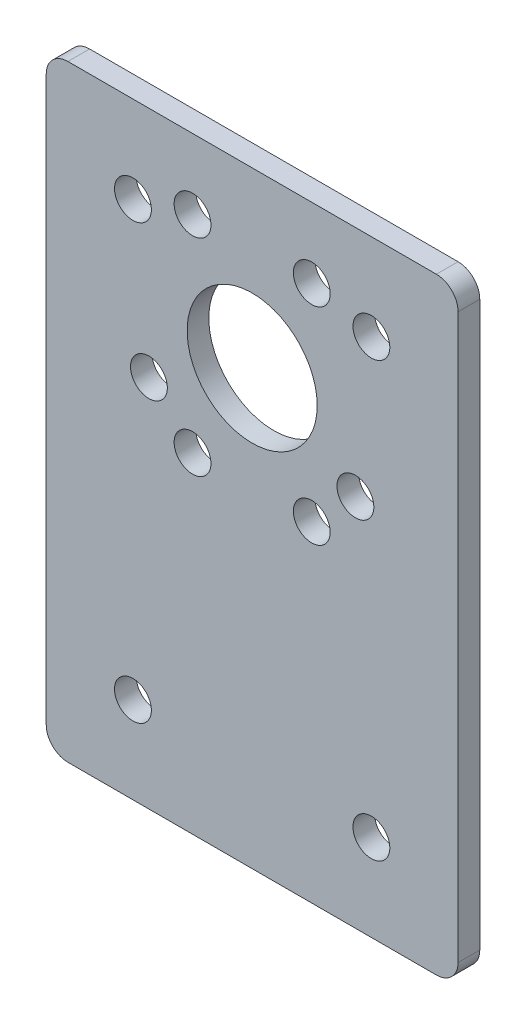
ISO-10303-21;
HEADER;
FILE_DESCRIPTION(('STEP AP214'),'2;1');
FILE_NAME('part.step','',(''),(''),'','','');
FILE_SCHEMA(('AUTOMOTIVE_DESIGN { 1 0 10303 214 1 1 1 1 }'));
ENDSEC;
DATA;
#1=APPLICATION_CONTEXT('core data for automotive mechanical design processes');
#2=APPLICATION_PROTOCOL_DEFINITION('international standard','automotive_design',2000,#1);
#3=PRODUCT_CONTEXT('',#1,'mechanical');
#4=PRODUCT('Part','Part','',(#3));
#5=PRODUCT_RELATED_PRODUCT_CATEGORY('part','',(#4));
#6=PRODUCT_DEFINITION_FORMATION('','',#4);
#7=PRODUCT_DEFINITION_CONTEXT('part definition',#1,'design');
#8=PRODUCT_DEFINITION('design','',#6,#7);
#9=PRODUCT_DEFINITION_SHAPE('','',#8);
#10=(LENGTH_UNIT() NAMED_UNIT(*) SI_UNIT(.MILLI.,.METRE.));
#11=(NAMED_UNIT(*) PLANE_ANGLE_UNIT() SI_UNIT($,.RADIAN.));
#12=(NAMED_UNIT(*) SI_UNIT($,.STERADIAN.) SOLID_ANGLE_UNIT());
#13=UNCERTAINTY_MEASURE_WITH_UNIT(LENGTH_MEASURE(1.E-05),#10,'distance_accuracy_value','');
#14=(GEOMETRIC_REPRESENTATION_CONTEXT(3) GLOBAL_UNCERTAINTY_ASSIGNED_CONTEXT((#13)) GLOBAL_UNIT_ASSIGNED_CONTEXT((#10,
#11,#12)) REPRESENTATION_CONTEXT('',''));
#15=CARTESIAN_POINT('',(0.,0.,0.));
#16=DIRECTION('',(0.,0.,1.));
#17=DIRECTION('',(1.,0.,0.));
#18=AXIS2_PLACEMENT_3D('',#15,#16,#17);
#19=CARTESIAN_POINT('',(-17.,26.,2.));
#20=DIRECTION('',(0.,0.,-1.));
#21=DIRECTION('',(-1.,0.,0.));
#22=AXIS2_PLACEMENT_3D('',#19,#20,#21);
#23=PLANE('',#22);
#24=CARTESIAN_POINT('',(-5.5,2.47372055837112,2.));
#25=DIRECTION('',(0.,0.,-1.));
#26=DIRECTION('',(-1.,0.,0.));
#27=AXIS2_PLACEMENT_3D('',#24,#25,#26);
#28=CIRCLE('',#27,1.7);
#29=CARTESIAN_POINT('',(-7.2,2.47372055837112,2.));
#30=VERTEX_POINT('',#29);
#31=EDGE_CURVE('E295',#30,#30,#28,.T.);
#32=ORIENTED_EDGE('',*,*,#31,.T.);
#33=EDGE_LOOP('',(#32));
#34=FACE_BOUND('',#33,.T.);
#35=CARTESIAN_POINT('',(-5.5,21.5262794416289,2.));
#36=DIRECTION('',(0.,0.,-1.));
#37=DIRECTION('',(-1.,0.,0.));
#38=AXIS2_PLACEMENT_3D('',#35,#36,#37);
#39=CIRCLE('',#38,1.7);
#40=CARTESIAN_POINT('',(-7.2,21.5262794416289,2.));
#41=VERTEX_POINT('',#40);
#42=EDGE_CURVE('E287',#41,#41,#39,.T.);
#43=ORIENTED_EDGE('',*,*,#42,.T.);
#44=EDGE_LOOP('',(#43));
#45=FACE_BOUND('',#44,.T.);
#46=CARTESIAN_POINT('',(5.5,21.5262794416289,2.));
#47=DIRECTION('',(0.,0.,-1.));
#48=DIRECTION('',(-1.,0.,0.));
#49=AXIS2_PLACEMENT_3D('',#46,#47,#48);
#50=CIRCLE('',#49,1.7);
#51=CARTESIAN_POINT('',(3.8,21.5262794416289,2.));
#52=VERTEX_POINT('',#51);
#53=EDGE_CURVE('E279',#52,#52,#50,.T.);
#54=ORIENTED_EDGE('',*,*,#53,.T.);
#55=EDGE_LOOP('',(#54));
#56=FACE_BOUND('',#55,.T.);
#57=CARTESIAN_POINT('',(5.5,2.47372055837112,2.));
#58=DIRECTION('',(0.,0.,-1.));
#59=DIRECTION('',(-1.,0.,0.));
#60=AXIS2_PLACEMENT_3D('',#57,#58,#59);
#61=CIRCLE('',#60,1.7);
#62=CARTESIAN_POINT('',(3.8,2.47372055837112,2.));
#63=VERTEX_POINT('',#62);
#64=EDGE_CURVE('E271',#63,#63,#61,.T.);
#65=ORIENTED_EDGE('',*,*,#64,.T.);
#66=EDGE_LOOP('',(#65));
#67=FACE_BOUND('',#66,.T.);
#68=CARTESIAN_POINT('',(9.52627944162889,6.50000000000001,2.));
#69=DIRECTION('',(0.,0.,-1.));
#70=DIRECTION('',(-1.,0.,0.));
#71=AXIS2_PLACEMENT_3D('',#68,#69,#70);
#72=CIRCLE('',#71,1.7);
#73=CARTESIAN_POINT('',(7.82627944162889,6.50000000000001,2.));
#74=VERTEX_POINT('',#73);
#75=EDGE_CURVE('E263',#74,#74,#72,.T.);
#76=ORIENTED_EDGE('',*,*,#75,.T.);
#77=EDGE_LOOP('',(#76));
#78=FACE_BOUND('',#77,.T.);
#79=CARTESIAN_POINT('',(-9.52627944162889,6.50000000000001,2.));
#80=DIRECTION('',(0.,0.,-1.));
#81=DIRECTION('',(-1.,0.,0.));
#82=AXIS2_PLACEMENT_3D('',#79,#80,#81);
#83=CIRCLE('',#82,1.7);
#84=CARTESIAN_POINT('',(-11.2262794416289,6.50000000000001,2.));
#85=VERTEX_POINT('',#84);
#86=EDGE_CURVE('E255',#85,#85,#83,.T.);
#87=ORIENTED_EDGE('',*,*,#86,.T.);
#88=EDGE_LOOP('',(#87));
#89=FACE_BOUND('',#88,.T.);
#90=CARTESIAN_POINT('',(11.,20.,2.));
#91=DIRECTION('',(0.,0.,-1.));
#92=DIRECTION('',(-1.,0.,0.));
#93=AXIS2_PLACEMENT_3D('',#90,#91,#92);
#94=CIRCLE('',#93,1.7);
#95=CARTESIAN_POINT('',(9.3,20.,2.));
#96=VERTEX_POINT('',#95);
#97=EDGE_CURVE('E247',#96,#96,#94,.T.);
#98=ORIENTED_EDGE('',*,*,#97,.T.);
#99=EDGE_LOOP('',(#98));
#100=FACE_BOUND('',#99,.T.);
#101=CARTESIAN_POINT('',(-11.,20.,2.));
#102=DIRECTION('',(0.,0.,-1.));
#103=DIRECTION('',(-1.,0.,0.));
#104=AXIS2_PLACEMENT_3D('',#101,#102,#103);
#105=CIRCLE('',#104,1.7);
#106=CARTESIAN_POINT('',(-12.7,20.,2.));
#107=VERTEX_POINT('',#106);
#108=EDGE_CURVE('E239',#107,#107,#105,.T.);
#109=ORIENTED_EDGE('',*,*,#108,.T.);
#110=EDGE_LOOP('',(#109));
#111=FACE_BOUND('',#110,.T.);
#112=CARTESIAN_POINT('',(11.,-20.,2.));
#113=DIRECTION('',(0.,0.,-1.));
#114=DIRECTION('',(-1.,0.,0.));
#115=AXIS2_PLACEMENT_3D('',#112,#113,#114);
#116=CIRCLE('',#115,1.7);
#117=CARTESIAN_POINT('',(9.3,-20.,2.));
#118=VERTEX_POINT('',#117);
#119=EDGE_CURVE('E231',#118,#118,#116,.T.);
#120=ORIENTED_EDGE('',*,*,#119,.T.);
#121=EDGE_LOOP('',(#120));
#122=FACE_BOUND('',#121,.T.);
#123=CARTESIAN_POINT('',(-11.,-20.,2.));
#124=DIRECTION('',(0.,0.,-1.));
#125=DIRECTION('',(-1.,0.,0.));
#126=AXIS2_PLACEMENT_3D('',#123,#124,#125);
#127=CIRCLE('',#126,1.7);
#128=CARTESIAN_POINT('',(-12.7,-20.,2.));
#129=VERTEX_POINT('',#128);
#130=EDGE_CURVE('E220',#129,#129,#127,.T.);
#131=ORIENTED_EDGE('',*,*,#130,.T.);
#132=EDGE_LOOP('',(#131));
#133=FACE_BOUND('',#132,.T.);
#134=CARTESIAN_POINT('',(-17.,26.,2.));
#135=DIRECTION('',(0.,0.,1.));
#136=DIRECTION('',(-1.,0.,0.));
#137=AXIS2_PLACEMENT_3D('',#134,#135,#136);
#138=CIRCLE('',#137,2.);
#139=CARTESIAN_POINT('',(-17.,28.,2.));
#140=VERTEX_POINT('',#139);
#141=CARTESIAN_POINT('',(-19.,26.,2.));
#142=VERTEX_POINT('',#141);
#143=EDGE_CURVE('E169',#140,#142,#138,.T.);
#144=ORIENTED_EDGE('',*,*,#143,.T.);
#145=DIRECTION('',(0.,-1.,0.));
#146=VECTOR('',#145,1.);
#147=CARTESIAN_POINT('',(-19.,26.,2.));
#148=LINE('',#147,#146);
#149=CARTESIAN_POINT('',(-19.,-26.,2.));
#150=VERTEX_POINT('',#149);
#151=EDGE_CURVE('E104',#142,#150,#148,.T.);
#152=ORIENTED_EDGE('',*,*,#151,.T.);
#153=CARTESIAN_POINT('',(-17.,-26.,2.));
#154=DIRECTION('',(0.,0.,1.));
#155=DIRECTION('',(-1.,0.,0.));
#156=AXIS2_PLACEMENT_3D('',#153,#154,#155);
#157=CIRCLE('',#156,2.);
#158=CARTESIAN_POINT('',(-17.,-28.,2.));
#159=VERTEX_POINT('',#158);
#160=EDGE_CURVE('E191',#150,#159,#157,.T.);
#161=ORIENTED_EDGE('',*,*,#160,.T.);
#162=DIRECTION('',(1.,0.,0.));
#163=VECTOR('',#162,1.);
#164=CARTESIAN_POINT('',(-17.,-28.,2.));
#165=LINE('',#164,#163);
#166=CARTESIAN_POINT('',(17.,-28.,2.));
#167=VERTEX_POINT('',#166);
#168=EDGE_CURVE('E205',#159,#167,#165,.T.);
#169=ORIENTED_EDGE('',*,*,#168,.T.);
#170=CARTESIAN_POINT('',(17.,-26.,2.));
#171=DIRECTION('',(0.,0.,1.));
#172=DIRECTION('',(1.,0.,0.));
#173=AXIS2_PLACEMENT_3D('',#170,#171,#172);
#174=CIRCLE('',#173,2.);
#175=CARTESIAN_POINT('',(19.,-26.,2.));
#176=VERTEX_POINT('',#175);
#177=EDGE_CURVE('E123',#167,#176,#174,.T.);
#178=ORIENTED_EDGE('',*,*,#177,.T.);
#179=DIRECTION('',(0.,1.,0.));
#180=VECTOR('',#179,1.);
#181=CARTESIAN_POINT('',(19.,26.,2.));
#182=LINE('',#181,#180);
#183=CARTESIAN_POINT('',(19.,26.,2.));
#184=VERTEX_POINT('',#183);
#185=EDGE_CURVE('E117',#176,#184,#182,.T.);
#186=ORIENTED_EDGE('',*,*,#185,.T.);
#187=CARTESIAN_POINT('',(17.,26.,2.));
#188=DIRECTION('',(0.,0.,1.));
#189=DIRECTION('',(1.,0.,0.));
#190=AXIS2_PLACEMENT_3D('',#187,#188,#189);
#191=CIRCLE('',#190,2.);
#192=CARTESIAN_POINT('',(17.,28.,2.));
#193=VERTEX_POINT('',#192);
#194=EDGE_CURVE('E121',#184,#193,#191,.T.);
#195=ORIENTED_EDGE('',*,*,#194,.T.);
#196=DIRECTION('',(-1.,0.,0.));
#197=VECTOR('',#196,1.);
#198=CARTESIAN_POINT('',(-17.,28.,2.));
#199=LINE('',#198,#197);
#200=EDGE_CURVE('E61',#193,#140,#199,.T.);
#201=ORIENTED_EDGE('',*,*,#200,.T.);
#202=EDGE_LOOP('',(#144,#152,#161,#169,#178,#186,#195,#201));
#203=FACE_BOUND('',#202,.T.);
#204=CARTESIAN_POINT('',(0.,12.,2.));
#205=DIRECTION('',(0.,0.,1.));
#206=DIRECTION('',(1.,0.,0.));
#207=AXIS2_PLACEMENT_3D('',#204,#205,#206);
#208=CIRCLE('',#207,6.);
#209=CARTESIAN_POINT('',(6.,12.,2.));
#210=VERTEX_POINT('',#209);
#211=EDGE_CURVE('E151',#210,#210,#208,.T.);
#212=ORIENTED_EDGE('',*,*,#211,.F.);
#213=EDGE_LOOP('',(#212));
#214=FACE_BOUND('',#213,.T.);
#215=ADVANCED_FACE('F43',(#34,#45,#56,#67,#78,#89,#100,#111,#122,#133,#203,#214),#23,.F.);
#216=CARTESIAN_POINT('',(-17.,26.,0.));
#217=DIRECTION('',(0.,0.,-1.));
#218=DIRECTION('',(-1.,0.,0.));
#219=AXIS2_PLACEMENT_3D('',#216,#217,#218);
#220=PLANE('',#219);
#221=CARTESIAN_POINT('',(-5.5,2.47372055837112,0.));
#222=DIRECTION('',(0.,0.,-1.));
#223=DIRECTION('',(-1.,0.,0.));
#224=AXIS2_PLACEMENT_3D('',#221,#222,#223);
#225=CIRCLE('',#224,1.7);
#226=CARTESIAN_POINT('',(-7.2,2.47372055837112,0.));
#227=VERTEX_POINT('',#226);
#228=EDGE_CURVE('E299',#227,#227,#225,.T.);
#229=ORIENTED_EDGE('',*,*,#228,.F.);
#230=EDGE_LOOP('',(#229));
#231=FACE_BOUND('',#230,.T.);
#232=CARTESIAN_POINT('',(-5.5,21.5262794416289,0.));
#233=DIRECTION('',(0.,0.,-1.));
#234=DIRECTION('',(-1.,0.,0.));
#235=AXIS2_PLACEMENT_3D('',#232,#233,#234);
#236=CIRCLE('',#235,1.7);
#237=CARTESIAN_POINT('',(-7.2,21.5262794416289,0.));
#238=VERTEX_POINT('',#237);
#239=EDGE_CURVE('E291',#238,#238,#236,.T.);
#240=ORIENTED_EDGE('',*,*,#239,.F.);
#241=EDGE_LOOP('',(#240));
#242=FACE_BOUND('',#241,.T.);
#243=CARTESIAN_POINT('',(5.5,21.5262794416289,0.));
#244=DIRECTION('',(0.,0.,-1.));
#245=DIRECTION('',(-1.,0.,0.));
#246=AXIS2_PLACEMENT_3D('',#243,#244,#245);
#247=CIRCLE('',#246,1.7);
#248=CARTESIAN_POINT('',(3.8,21.5262794416289,0.));
#249=VERTEX_POINT('',#248);
#250=EDGE_CURVE('E283',#249,#249,#247,.T.);
#251=ORIENTED_EDGE('',*,*,#250,.F.);
#252=EDGE_LOOP('',(#251));
#253=FACE_BOUND('',#252,.T.);
#254=CARTESIAN_POINT('',(5.5,2.47372055837112,0.));
#255=DIRECTION('',(0.,0.,-1.));
#256=DIRECTION('',(-1.,0.,0.));
#257=AXIS2_PLACEMENT_3D('',#254,#255,#256);
#258=CIRCLE('',#257,1.7);
#259=CARTESIAN_POINT('',(3.8,2.47372055837112,0.));
#260=VERTEX_POINT('',#259);
#261=EDGE_CURVE('E275',#260,#260,#258,.T.);
#262=ORIENTED_EDGE('',*,*,#261,.F.);
#263=EDGE_LOOP('',(#262));
#264=FACE_BOUND('',#263,.T.);
#265=CARTESIAN_POINT('',(9.52627944162889,6.50000000000001,0.));
#266=DIRECTION('',(0.,0.,-1.));
#267=DIRECTION('',(-1.,0.,0.));
#268=AXIS2_PLACEMENT_3D('',#265,#266,#267);
#269=CIRCLE('',#268,1.7);
#270=CARTESIAN_POINT('',(7.82627944162889,6.50000000000001,0.));
#271=VERTEX_POINT('',#270);
#272=EDGE_CURVE('E267',#271,#271,#269,.T.);
#273=ORIENTED_EDGE('',*,*,#272,.F.);
#274=EDGE_LOOP('',(#273));
#275=FACE_BOUND('',#274,.T.);
#276=CARTESIAN_POINT('',(-9.52627944162889,6.50000000000001,0.));
#277=DIRECTION('',(0.,0.,-1.));
#278=DIRECTION('',(-1.,0.,0.));
#279=AXIS2_PLACEMENT_3D('',#276,#277,#278);
#280=CIRCLE('',#279,1.7);
#281=CARTESIAN_POINT('',(-11.2262794416289,6.50000000000001,0.));
#282=VERTEX_POINT('',#281);
#283=EDGE_CURVE('E259',#282,#282,#280,.T.);
#284=ORIENTED_EDGE('',*,*,#283,.F.);
#285=EDGE_LOOP('',(#284));
#286=FACE_BOUND('',#285,.T.);
#287=CARTESIAN_POINT('',(11.,20.,0.));
#288=DIRECTION('',(0.,0.,-1.));
#289=DIRECTION('',(-1.,0.,0.));
#290=AXIS2_PLACEMENT_3D('',#287,#288,#289);
#291=CIRCLE('',#290,1.69999999999999);
#292=CARTESIAN_POINT('',(9.30000000000001,20.,0.));
#293=VERTEX_POINT('',#292);
#294=EDGE_CURVE('E251',#293,#293,#291,.T.);
#295=ORIENTED_EDGE('',*,*,#294,.F.);
#296=EDGE_LOOP('',(#295));
#297=FACE_BOUND('',#296,.T.);
#298=CARTESIAN_POINT('',(-11.,20.,0.));
#299=DIRECTION('',(0.,0.,-1.));
#300=DIRECTION('',(-1.,0.,0.));
#301=AXIS2_PLACEMENT_3D('',#298,#299,#300);
#302=CIRCLE('',#301,1.69999999999999);
#303=CARTESIAN_POINT('',(-12.7,20.,0.));
#304=VERTEX_POINT('',#303);
#305=EDGE_CURVE('E243',#304,#304,#302,.T.);
#306=ORIENTED_EDGE('',*,*,#305,.F.);
#307=EDGE_LOOP('',(#306));
#308=FACE_BOUND('',#307,.T.);
#309=CARTESIAN_POINT('',(11.,-20.,0.));
#310=DIRECTION('',(0.,0.,-1.));
#311=DIRECTION('',(-1.,0.,0.));
#312=AXIS2_PLACEMENT_3D('',#309,#310,#311);
#313=CIRCLE('',#312,1.69999999999999);
#314=CARTESIAN_POINT('',(9.30000000000001,-20.,0.));
#315=VERTEX_POINT('',#314);
#316=EDGE_CURVE('E235',#315,#315,#313,.T.);
#317=ORIENTED_EDGE('',*,*,#316,.F.);
#318=EDGE_LOOP('',(#317));
#319=FACE_BOUND('',#318,.T.);
#320=CARTESIAN_POINT('',(-11.,-20.,0.));
#321=DIRECTION('',(0.,0.,-1.));
#322=DIRECTION('',(-1.,0.,0.));
#323=AXIS2_PLACEMENT_3D('',#320,#321,#322);
#324=CIRCLE('',#323,1.69999999999999);
#325=CARTESIAN_POINT('',(-12.7,-20.,0.));
#326=VERTEX_POINT('',#325);
#327=EDGE_CURVE('E227',#326,#326,#324,.T.);
#328=ORIENTED_EDGE('',*,*,#327,.F.);
#329=EDGE_LOOP('',(#328));
#330=FACE_BOUND('',#329,.T.);
#331=CARTESIAN_POINT('',(-17.,26.,0.));
#332=DIRECTION('',(0.,0.,1.));
#333=DIRECTION('',(-1.,0.,0.));
#334=AXIS2_PLACEMENT_3D('',#331,#332,#333);
#335=CIRCLE('',#334,2.);
#336=CARTESIAN_POINT('',(-17.,28.,0.));
#337=VERTEX_POINT('',#336);
#338=CARTESIAN_POINT('',(-19.,26.,0.));
#339=VERTEX_POINT('',#338);
#340=EDGE_CURVE('E146',#337,#339,#335,.T.);
#341=ORIENTED_EDGE('',*,*,#340,.F.);
#342=DIRECTION('',(-1.,0.,0.));
#343=VECTOR('',#342,1.);
#344=CARTESIAN_POINT('',(-17.,28.,0.));
#345=LINE('',#344,#343);
#346=CARTESIAN_POINT('',(17.,28.,0.));
#347=VERTEX_POINT('',#346);
#348=EDGE_CURVE('E96',#347,#337,#345,.T.);
#349=ORIENTED_EDGE('',*,*,#348,.F.);
#350=CARTESIAN_POINT('',(17.,26.,0.));
#351=DIRECTION('',(0.,0.,1.));
#352=DIRECTION('',(1.,0.,0.));
#353=AXIS2_PLACEMENT_3D('',#350,#351,#352);
#354=CIRCLE('',#353,2.);
#355=CARTESIAN_POINT('',(19.,26.,0.));
#356=VERTEX_POINT('',#355);
#357=EDGE_CURVE('E90',#356,#347,#354,.T.);
#358=ORIENTED_EDGE('',*,*,#357,.F.);
#359=DIRECTION('',(0.,1.,0.));
#360=VECTOR('',#359,1.);
#361=CARTESIAN_POINT('',(19.,26.,0.));
#362=LINE('',#361,#360);
#363=CARTESIAN_POINT('',(19.,-26.,0.));
#364=VERTEX_POINT('',#363);
#365=EDGE_CURVE('E132',#364,#356,#362,.T.);
#366=ORIENTED_EDGE('',*,*,#365,.F.);
#367=CARTESIAN_POINT('',(17.,-26.,0.));
#368=DIRECTION('',(0.,0.,1.));
#369=DIRECTION('',(1.,0.,0.));
#370=AXIS2_PLACEMENT_3D('',#367,#368,#369);
#371=CIRCLE('',#370,2.);
#372=CARTESIAN_POINT('',(17.,-28.,0.));
#373=VERTEX_POINT('',#372);
#374=EDGE_CURVE('E160',#373,#364,#371,.T.);
#375=ORIENTED_EDGE('',*,*,#374,.F.);
#376=DIRECTION('',(1.,0.,0.));
#377=VECTOR('',#376,1.);
#378=CARTESIAN_POINT('',(-17.,-28.,0.));
#379=LINE('',#378,#377);
#380=CARTESIAN_POINT('',(-17.,-28.,0.));
#381=VERTEX_POINT('',#380);
#382=EDGE_CURVE('E157',#381,#373,#379,.T.);
#383=ORIENTED_EDGE('',*,*,#382,.F.);
#384=CARTESIAN_POINT('',(-17.,-26.,0.));
#385=DIRECTION('',(0.,0.,1.));
#386=DIRECTION('',(-1.,0.,0.));
#387=AXIS2_PLACEMENT_3D('',#384,#385,#386);
#388=CIRCLE('',#387,2.);
#389=CARTESIAN_POINT('',(-19.,-26.,0.));
#390=VERTEX_POINT('',#389);
#391=EDGE_CURVE('E154',#390,#381,#388,.T.);
#392=ORIENTED_EDGE('',*,*,#391,.F.);
#393=DIRECTION('',(0.,-1.,0.));
#394=VECTOR('',#393,1.);
#395=CARTESIAN_POINT('',(-19.,26.,0.));
#396=LINE('',#395,#394);
#397=EDGE_CURVE('E150',#339,#390,#396,.T.);
#398=ORIENTED_EDGE('',*,*,#397,.F.);
#399=EDGE_LOOP('',(#341,#349,#358,#366,#375,#383,#392,#398));
#400=FACE_BOUND('',#399,.T.);
#401=CARTESIAN_POINT('',(0.,12.,0.));
#402=DIRECTION('',(0.,0.,1.));
#403=DIRECTION('',(1.,0.,0.));
#404=AXIS2_PLACEMENT_3D('',#401,#402,#403);
#405=CIRCLE('',#404,6.);
#406=CARTESIAN_POINT('',(6.,12.,0.));
#407=VERTEX_POINT('',#406);
#408=EDGE_CURVE('E216',#407,#407,#405,.T.);
#409=ORIENTED_EDGE('',*,*,#408,.T.);
#410=EDGE_LOOP('',(#409));
#411=FACE_BOUND('',#410,.T.);
#412=ADVANCED_FACE('F195',(#231,#242,#253,#264,#275,#286,#297,#308,#319,#330,#400,#411),#220,.T.);
#413=CARTESIAN_POINT('',(-17.,26.,2.));
#414=DIRECTION('',(0.,0.,-1.));
#415=DIRECTION('',(-1.,0.,0.));
#416=AXIS2_PLACEMENT_3D('',#413,#414,#415);
#417=CYLINDRICAL_SURFACE('',#416,2.);
#418=ORIENTED_EDGE('',*,*,#340,.T.);
#419=DIRECTION('',(0.,0.,-1.));
#420=VECTOR('',#419,1.);
#421=CARTESIAN_POINT('',(-19.,26.,2.));
#422=LINE('',#421,#420);
#423=EDGE_CURVE('E11',#142,#339,#422,.T.);
#424=ORIENTED_EDGE('',*,*,#423,.F.);
#425=ORIENTED_EDGE('',*,*,#143,.F.);
#426=DIRECTION('',(0.,0.,-1.));
#427=VECTOR('',#426,1.);
#428=CARTESIAN_POINT('',(-17.,28.,2.));
#429=LINE('',#428,#427);
#430=EDGE_CURVE('E142',#140,#337,#429,.T.);
#431=ORIENTED_EDGE('',*,*,#430,.T.);
#432=EDGE_LOOP('',(#418,#424,#425,#431));
#433=FACE_BOUND('',#432,.T.);
#434=ADVANCED_FACE('F45',(#433),#417,.T.);
#435=CARTESIAN_POINT('',(-19.,26.,2.));
#436=DIRECTION('',(1.,0.,0.));
#437=DIRECTION('',(0.,0.,-1.));
#438=AXIS2_PLACEMENT_3D('',#435,#436,#437);
#439=PLANE('',#438);
#440=ORIENTED_EDGE('',*,*,#397,.T.);
#441=DIRECTION('',(0.,0.,-1.));
#442=VECTOR('',#441,1.);
#443=CARTESIAN_POINT('',(-19.,-26.,2.));
#444=LINE('',#443,#442);
#445=EDGE_CURVE('E53',#150,#390,#444,.T.);
#446=ORIENTED_EDGE('',*,*,#445,.F.);
#447=ORIENTED_EDGE('',*,*,#151,.F.);
#448=ORIENTED_EDGE('',*,*,#423,.T.);
#449=EDGE_LOOP('',(#440,#446,#447,#448));
#450=FACE_BOUND('',#449,.T.);
#451=ADVANCED_FACE('F363',(#450),#439,.F.);
#452=CARTESIAN_POINT('',(-17.,-26.,2.));
#453=DIRECTION('',(0.,0.,-1.));
#454=DIRECTION('',(-1.,0.,0.));
#455=AXIS2_PLACEMENT_3D('',#452,#453,#454);
#456=CYLINDRICAL_SURFACE('',#455,2.);
#457=ORIENTED_EDGE('',*,*,#391,.T.);
#458=DIRECTION('',(0.,0.,-1.));
#459=VECTOR('',#458,1.);
#460=CARTESIAN_POINT('',(-17.,-28.,2.));
#461=LINE('',#460,#459);
#462=EDGE_CURVE('E180',#159,#381,#461,.T.);
#463=ORIENTED_EDGE('',*,*,#462,.F.);
#464=ORIENTED_EDGE('',*,*,#160,.F.);
#465=ORIENTED_EDGE('',*,*,#445,.T.);
#466=EDGE_LOOP('',(#457,#463,#464,#465));
#467=FACE_BOUND('',#466,.T.);
#468=ADVANCED_FACE('F189',(#467),#456,.T.);
#469=CARTESIAN_POINT('',(-17.,-28.,2.));
#470=DIRECTION('',(0.,1.,0.));
#471=DIRECTION('',(0.,0.,1.));
#472=AXIS2_PLACEMENT_3D('',#469,#470,#471);
#473=PLANE('',#472);
#474=ORIENTED_EDGE('',*,*,#382,.T.);
#475=DIRECTION('',(0.,0.,-1.));
#476=VECTOR('',#475,1.);
#477=CARTESIAN_POINT('',(17.,-28.,2.));
#478=LINE('',#477,#476);
#479=EDGE_CURVE('E176',#167,#373,#478,.T.);
#480=ORIENTED_EDGE('',*,*,#479,.F.);
#481=ORIENTED_EDGE('',*,*,#168,.F.);
#482=ORIENTED_EDGE('',*,*,#462,.T.);
#483=EDGE_LOOP('',(#474,#480,#481,#482));
#484=FACE_BOUND('',#483,.T.);
#485=ADVANCED_FACE('F200',(#484),#473,.F.);
#486=CARTESIAN_POINT('',(17.,-26.,2.));
#487=DIRECTION('',(0.,0.,-1.));
#488=DIRECTION('',(-1.,0.,0.));
#489=AXIS2_PLACEMENT_3D('',#486,#487,#488);
#490=CYLINDRICAL_SURFACE('',#489,2.);
#491=ORIENTED_EDGE('',*,*,#374,.T.);
#492=DIRECTION('',(0.,0.,-1.));
#493=VECTOR('',#492,1.);
#494=CARTESIAN_POINT('',(19.,-26.,2.));
#495=LINE('',#494,#493);
#496=EDGE_CURVE('E134',#176,#364,#495,.T.);
#497=ORIENTED_EDGE('',*,*,#496,.F.);
#498=ORIENTED_EDGE('',*,*,#177,.F.);
#499=ORIENTED_EDGE('',*,*,#479,.T.);
#500=EDGE_LOOP('',(#491,#497,#498,#499));
#501=FACE_BOUND('',#500,.T.);
#502=ADVANCED_FACE('F203',(#501),#490,.T.);
#503=CARTESIAN_POINT('',(19.,26.,2.));
#504=DIRECTION('',(-1.,0.,0.));
#505=DIRECTION('',(0.,0.,1.));
#506=AXIS2_PLACEMENT_3D('',#503,#504,#505);
#507=PLANE('',#506);
#508=ORIENTED_EDGE('',*,*,#365,.T.);
#509=DIRECTION('',(0.,0.,-1.));
#510=VECTOR('',#509,1.);
#511=CARTESIAN_POINT('',(19.,26.,2.));
#512=LINE('',#511,#510);
#513=EDGE_CURVE('E129',#184,#356,#512,.T.);
#514=ORIENTED_EDGE('',*,*,#513,.F.);
#515=ORIENTED_EDGE('',*,*,#185,.F.);
#516=ORIENTED_EDGE('',*,*,#496,.T.);
#517=EDGE_LOOP('',(#508,#514,#515,#516));
#518=FACE_BOUND('',#517,.T.);
#519=ADVANCED_FACE('F130',(#518),#507,.F.);
#520=CARTESIAN_POINT('',(17.,26.,2.));
#521=DIRECTION('',(0.,0.,-1.));
#522=DIRECTION('',(-1.,0.,0.));
#523=AXIS2_PLACEMENT_3D('',#520,#521,#522);
#524=CYLINDRICAL_SURFACE('',#523,2.);
#525=ORIENTED_EDGE('',*,*,#357,.T.);
#526=DIRECTION('',(0.,0.,-1.));
#527=VECTOR('',#526,1.);
#528=CARTESIAN_POINT('',(17.,28.,2.));
#529=LINE('',#528,#527);
#530=EDGE_CURVE('E135',#193,#347,#529,.T.);
#531=ORIENTED_EDGE('',*,*,#530,.F.);
#532=ORIENTED_EDGE('',*,*,#194,.F.);
#533=ORIENTED_EDGE('',*,*,#513,.T.);
#534=EDGE_LOOP('',(#525,#531,#532,#533));
#535=FACE_BOUND('',#534,.T.);
#536=ADVANCED_FACE('F137',(#535),#524,.T.);
#537=CARTESIAN_POINT('',(-17.,28.,2.));
#538=DIRECTION('',(0.,-1.,0.));
#539=DIRECTION('',(0.,0.,-1.));
#540=AXIS2_PLACEMENT_3D('',#537,#538,#539);
#541=PLANE('',#540);
#542=ORIENTED_EDGE('',*,*,#348,.T.);
#543=ORIENTED_EDGE('',*,*,#430,.F.);
#544=ORIENTED_EDGE('',*,*,#200,.F.);
#545=ORIENTED_EDGE('',*,*,#530,.T.);
#546=EDGE_LOOP('',(#542,#543,#544,#545));
#547=FACE_BOUND('',#546,.T.);
#548=ADVANCED_FACE('F341',(#547),#541,.F.);
#549=CARTESIAN_POINT('',(0.,12.,2.));
#550=DIRECTION('',(0.,0.,-1.));
#551=DIRECTION('',(-1.,0.,0.));
#552=AXIS2_PLACEMENT_3D('',#549,#550,#551);
#553=CYLINDRICAL_SURFACE('',#552,6.);
#554=ORIENTED_EDGE('',*,*,#211,.T.);
#555=EDGE_LOOP('',(#554));
#556=FACE_BOUND('',#555,.T.);
#557=ORIENTED_EDGE('',*,*,#408,.F.);
#558=EDGE_LOOP('',(#557));
#559=FACE_BOUND('',#558,.T.);
#560=ADVANCED_FACE('F331',(#556,#559),#553,.F.);
#561=CARTESIAN_POINT('',(-11.,-20.,0.));
#562=DIRECTION('',(0.,0.,-1.));
#563=DIRECTION('',(-1.,0.,0.));
#564=AXIS2_PLACEMENT_3D('',#561,#562,#563);
#565=CYLINDRICAL_SURFACE('',#564,1.69999999999999);
#566=ORIENTED_EDGE('',*,*,#130,.F.);
#567=EDGE_LOOP('',(#566));
#568=FACE_BOUND('',#567,.T.);
#569=ORIENTED_EDGE('',*,*,#327,.T.);
#570=EDGE_LOOP('',(#569));
#571=FACE_BOUND('',#570,.T.);
#572=ADVANCED_FACE('F328',(#568,#571),#565,.F.);
#573=CARTESIAN_POINT('',(11.,-20.,0.));
#574=DIRECTION('',(0.,0.,-1.));
#575=DIRECTION('',(-1.,0.,0.));
#576=AXIS2_PLACEMENT_3D('',#573,#574,#575);
#577=CYLINDRICAL_SURFACE('',#576,1.69999999999999);
#578=ORIENTED_EDGE('',*,*,#119,.F.);
#579=EDGE_LOOP('',(#578));
#580=FACE_BOUND('',#579,.T.);
#581=ORIENTED_EDGE('',*,*,#316,.T.);
#582=EDGE_LOOP('',(#581));
#583=FACE_BOUND('',#582,.T.);
#584=ADVANCED_FACE('F330',(#580,#583),#577,.F.);
#585=CARTESIAN_POINT('',(-11.,20.,0.));
#586=DIRECTION('',(0.,0.,-1.));
#587=DIRECTION('',(-1.,0.,0.));
#588=AXIS2_PLACEMENT_3D('',#585,#586,#587);
#589=CYLINDRICAL_SURFACE('',#588,1.69999999999999);
#590=ORIENTED_EDGE('',*,*,#108,.F.);
#591=EDGE_LOOP('',(#590));
#592=FACE_BOUND('',#591,.T.);
#593=ORIENTED_EDGE('',*,*,#305,.T.);
#594=EDGE_LOOP('',(#593));
#595=FACE_BOUND('',#594,.T.);
#596=ADVANCED_FACE('F338',(#592,#595),#589,.F.);
#597=CARTESIAN_POINT('',(11.,20.,0.));
#598=DIRECTION('',(0.,0.,-1.));
#599=DIRECTION('',(-1.,0.,0.));
#600=AXIS2_PLACEMENT_3D('',#597,#598,#599);
#601=CYLINDRICAL_SURFACE('',#600,1.69999999999999);
#602=ORIENTED_EDGE('',*,*,#97,.F.);
#603=EDGE_LOOP('',(#602));
#604=FACE_BOUND('',#603,.T.);
#605=ORIENTED_EDGE('',*,*,#294,.T.);
#606=EDGE_LOOP('',(#605));
#607=FACE_BOUND('',#606,.T.);
#608=ADVANCED_FACE('F391',(#604,#607),#601,.F.);
#609=CARTESIAN_POINT('',(-9.52627944162889,6.50000000000001,0.));
#610=DIRECTION('',(0.,0.,-1.));
#611=DIRECTION('',(-1.,0.,0.));
#612=AXIS2_PLACEMENT_3D('',#609,#610,#611);
#613=CYLINDRICAL_SURFACE('',#612,1.7);
#614=ORIENTED_EDGE('',*,*,#86,.F.);
#615=EDGE_LOOP('',(#614));
#616=FACE_BOUND('',#615,.T.);
#617=ORIENTED_EDGE('',*,*,#283,.T.);
#618=EDGE_LOOP('',(#617));
#619=FACE_BOUND('',#618,.T.);
#620=ADVANCED_FACE('F385',(#616,#619),#613,.F.);
#621=CARTESIAN_POINT('',(9.52627944162889,6.50000000000001,0.));
#622=DIRECTION('',(0.,0.,-1.));
#623=DIRECTION('',(-1.,0.,0.));
#624=AXIS2_PLACEMENT_3D('',#621,#622,#623);
#625=CYLINDRICAL_SURFACE('',#624,1.7);
#626=ORIENTED_EDGE('',*,*,#75,.F.);
#627=EDGE_LOOP('',(#626));
#628=FACE_BOUND('',#627,.T.);
#629=ORIENTED_EDGE('',*,*,#272,.T.);
#630=EDGE_LOOP('',(#629));
#631=FACE_BOUND('',#630,.T.);
#632=ADVANCED_FACE('F390',(#628,#631),#625,.F.);
#633=CARTESIAN_POINT('',(5.5,2.47372055837112,0.));
#634=DIRECTION('',(0.,0.,-1.));
#635=DIRECTION('',(-1.,0.,0.));
#636=AXIS2_PLACEMENT_3D('',#633,#634,#635);
#637=CYLINDRICAL_SURFACE('',#636,1.7);
#638=ORIENTED_EDGE('',*,*,#64,.F.);
#639=EDGE_LOOP('',(#638));
#640=FACE_BOUND('',#639,.T.);
#641=ORIENTED_EDGE('',*,*,#261,.T.);
#642=EDGE_LOOP('',(#641));
#643=FACE_BOUND('',#642,.T.);
#644=ADVANCED_FACE('F403',(#640,#643),#637,.F.);
#645=CARTESIAN_POINT('',(5.5,21.5262794416289,0.));
#646=DIRECTION('',(0.,0.,-1.));
#647=DIRECTION('',(-1.,0.,0.));
#648=AXIS2_PLACEMENT_3D('',#645,#646,#647);
#649=CYLINDRICAL_SURFACE('',#648,1.7);
#650=ORIENTED_EDGE('',*,*,#53,.F.);
#651=EDGE_LOOP('',(#650));
#652=FACE_BOUND('',#651,.T.);
#653=ORIENTED_EDGE('',*,*,#250,.T.);
#654=EDGE_LOOP('',(#653));
#655=FACE_BOUND('',#654,.T.);
#656=ADVANCED_FACE('F413',(#652,#655),#649,.F.);
#657=CARTESIAN_POINT('',(-5.5,21.5262794416289,0.));
#658=DIRECTION('',(0.,0.,-1.));
#659=DIRECTION('',(-1.,0.,0.));
#660=AXIS2_PLACEMENT_3D('',#657,#658,#659);
#661=CYLINDRICAL_SURFACE('',#660,1.7);
#662=ORIENTED_EDGE('',*,*,#42,.F.);
#663=EDGE_LOOP('',(#662));
#664=FACE_BOUND('',#663,.T.);
#665=ORIENTED_EDGE('',*,*,#239,.T.);
#666=EDGE_LOOP('',(#665));
#667=FACE_BOUND('',#666,.T.);
#668=ADVANCED_FACE('F423',(#664,#667),#661,.F.);
#669=CARTESIAN_POINT('',(-5.5,2.47372055837112,0.));
#670=DIRECTION('',(0.,0.,-1.));
#671=DIRECTION('',(-1.,0.,0.));
#672=AXIS2_PLACEMENT_3D('',#669,#670,#671);
#673=CYLINDRICAL_SURFACE('',#672,1.7);
#674=ORIENTED_EDGE('',*,*,#31,.F.);
#675=EDGE_LOOP('',(#674));
#676=FACE_BOUND('',#675,.T.);
#677=ORIENTED_EDGE('',*,*,#228,.T.);
#678=EDGE_LOOP('',(#677));
#679=FACE_BOUND('',#678,.T.);
#680=ADVANCED_FACE('F305',(#676,#679),#673,.F.);
#681=CLOSED_SHELL('',(#215,#412,#434,#451,#468,#485,#502,#519,#536,#548,#560,#572,#584,#596,
#608,#620,#632,#644,#656,#668,#680));
#682=MANIFOLD_SOLID_BREP('B2',#681);
#683=ADVANCED_BREP_SHAPE_REPRESENTATION('',(#18,#682),#14);
#684=SHAPE_DEFINITION_REPRESENTATION(#9,#683);
ENDSEC;
END-ISO-10303-21;
